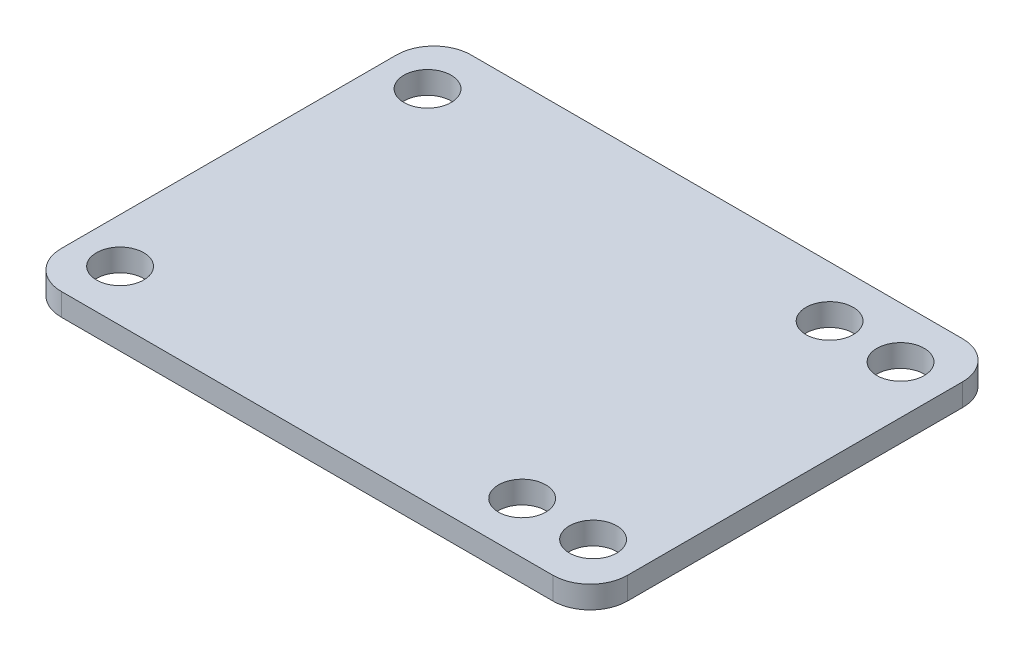
ISO-10303-21;
HEADER;
FILE_DESCRIPTION(('STEP AP214'),'2;1');
FILE_NAME('part.step','',(''),(''),'','','');
FILE_SCHEMA(('AUTOMOTIVE_DESIGN { 1 0 10303 214 1 1 1 1 }'));
ENDSEC;
DATA;
#1=APPLICATION_CONTEXT('core data for automotive mechanical design processes');
#2=APPLICATION_PROTOCOL_DEFINITION('international standard','automotive_design',2000,#1);
#3=PRODUCT_CONTEXT('',#1,'mechanical');
#4=PRODUCT('Part','Part','',(#3));
#5=PRODUCT_RELATED_PRODUCT_CATEGORY('part','',(#4));
#6=PRODUCT_DEFINITION_FORMATION('','',#4);
#7=PRODUCT_DEFINITION_CONTEXT('part definition',#1,'design');
#8=PRODUCT_DEFINITION('design','',#6,#7);
#9=PRODUCT_DEFINITION_SHAPE('','',#8);
#10=(LENGTH_UNIT() NAMED_UNIT(*) SI_UNIT(.MILLI.,.METRE.));
#11=(NAMED_UNIT(*) PLANE_ANGLE_UNIT() SI_UNIT($,.RADIAN.));
#12=(NAMED_UNIT(*) SI_UNIT($,.STERADIAN.) SOLID_ANGLE_UNIT());
#13=UNCERTAINTY_MEASURE_WITH_UNIT(LENGTH_MEASURE(1.E-05),#10,'distance_accuracy_value','');
#14=(GEOMETRIC_REPRESENTATION_CONTEXT(3) GLOBAL_UNCERTAINTY_ASSIGNED_CONTEXT((#13)) GLOBAL_UNIT_ASSIGNED_CONTEXT((#10,
#11,#12)) REPRESENTATION_CONTEXT('',''));
#15=CARTESIAN_POINT('',(0.,0.,0.));
#16=DIRECTION('',(0.,0.,1.));
#17=DIRECTION('',(1.,0.,0.));
#18=AXIS2_PLACEMENT_3D('',#15,#16,#17);
#19=CARTESIAN_POINT('',(0.,3.,0.));
#20=DIRECTION('',(1.,0.,0.));
#21=DIRECTION('',(0.,0.,-1.));
#22=AXIS2_PLACEMENT_3D('',#19,#20,#21);
#23=PLANE('',#22);
#24=DIRECTION('',(0.,0.,1.));
#25=VECTOR('',#24,1.);
#26=CARTESIAN_POINT('',(0.,0.,0.));
#27=LINE('',#26,#25);
#28=CARTESIAN_POINT('',(0.,0.,-50.));
#29=VERTEX_POINT('',#28);
#30=CARTESIAN_POINT('',(0.,0.,-5.));
#31=VERTEX_POINT('',#30);
#32=EDGE_CURVE('E138',#29,#31,#27,.T.);
#33=ORIENTED_EDGE('',*,*,#32,.T.);
#34=DIRECTION('',(0.,-1.,0.));
#35=VECTOR('',#34,1.);
#36=CARTESIAN_POINT('',(0.,3.,-5.));
#37=LINE('',#36,#35);
#38=CARTESIAN_POINT('',(0.,3.,-5.));
#39=VERTEX_POINT('',#38);
#40=EDGE_CURVE('E161',#31,#39,#37,.F.);
#41=ORIENTED_EDGE('',*,*,#40,.T.);
#42=DIRECTION('',(0.,0.,1.));
#43=VECTOR('',#42,1.);
#44=CARTESIAN_POINT('',(0.,3.,0.));
#45=LINE('',#44,#43);
#46=CARTESIAN_POINT('',(0.,3.,-50.));
#47=VERTEX_POINT('',#46);
#48=EDGE_CURVE('E136',#47,#39,#45,.T.);
#49=ORIENTED_EDGE('',*,*,#48,.F.);
#50=DIRECTION('',(0.,-1.,0.));
#51=VECTOR('',#50,1.);
#52=CARTESIAN_POINT('',(0.,3.,-50.));
#53=LINE('',#52,#51);
#54=EDGE_CURVE('E158',#47,#29,#53,.T.);
#55=ORIENTED_EDGE('',*,*,#54,.T.);
#56=EDGE_LOOP('',(#33,#41,#49,#55));
#57=FACE_BOUND('',#56,.T.);
#58=ADVANCED_FACE('F43',(#57),#23,.F.);
#59=CARTESIAN_POINT('',(0.,3.,0.));
#60=DIRECTION('',(0.,0.,-1.));
#61=DIRECTION('',(-1.,0.,0.));
#62=AXIS2_PLACEMENT_3D('',#59,#60,#61);
#63=PLANE('',#62);
#64=DIRECTION('',(1.,0.,0.));
#65=VECTOR('',#64,1.);
#66=CARTESIAN_POINT('',(0.,0.,0.));
#67=LINE('',#66,#65);
#68=CARTESIAN_POINT('',(5.,0.,0.));
#69=VERTEX_POINT('',#68);
#70=CARTESIAN_POINT('',(71.,0.,0.));
#71=VERTEX_POINT('',#70);
#72=EDGE_CURVE('E134',#69,#71,#67,.T.);
#73=ORIENTED_EDGE('',*,*,#72,.T.);
#74=DIRECTION('',(0.,-1.,0.));
#75=VECTOR('',#74,1.);
#76=CARTESIAN_POINT('',(71.,3.,0.));
#77=LINE('',#76,#75);
#78=CARTESIAN_POINT('',(71.,3.,0.));
#79=VERTEX_POINT('',#78);
#80=EDGE_CURVE('E113',#71,#79,#77,.F.);
#81=ORIENTED_EDGE('',*,*,#80,.T.);
#82=DIRECTION('',(1.,0.,0.));
#83=VECTOR('',#82,1.);
#84=CARTESIAN_POINT('',(0.,3.,0.));
#85=LINE('',#84,#83);
#86=CARTESIAN_POINT('',(5.,3.,0.));
#87=VERTEX_POINT('',#86);
#88=EDGE_CURVE('E177',#87,#79,#85,.T.);
#89=ORIENTED_EDGE('',*,*,#88,.F.);
#90=DIRECTION('',(0.,-1.,0.));
#91=VECTOR('',#90,1.);
#92=CARTESIAN_POINT('',(5.,3.,0.));
#93=LINE('',#92,#91);
#94=EDGE_CURVE('E118',#87,#69,#93,.T.);
#95=ORIENTED_EDGE('',*,*,#94,.T.);
#96=EDGE_LOOP('',(#73,#81,#89,#95));
#97=FACE_BOUND('',#96,.T.);
#98=ADVANCED_FACE('F234',(#97),#63,.F.);
#99=CARTESIAN_POINT('',(76.,3.,0.));
#100=DIRECTION('',(-1.,0.,0.));
#101=DIRECTION('',(0.,0.,1.));
#102=AXIS2_PLACEMENT_3D('',#99,#100,#101);
#103=PLANE('',#102);
#104=DIRECTION('',(0.,0.,-1.));
#105=VECTOR('',#104,1.);
#106=CARTESIAN_POINT('',(76.,3.,0.));
#107=LINE('',#106,#105);
#108=CARTESIAN_POINT('',(76.,3.,-5.));
#109=VERTEX_POINT('',#108);
#110=CARTESIAN_POINT('',(76.,3.,-50.));
#111=VERTEX_POINT('',#110);
#112=EDGE_CURVE('E127',#109,#111,#107,.T.);
#113=ORIENTED_EDGE('',*,*,#112,.F.);
#114=DIRECTION('',(0.,-1.,0.));
#115=VECTOR('',#114,1.);
#116=CARTESIAN_POINT('',(76.,3.,-5.));
#117=LINE('',#116,#115);
#118=CARTESIAN_POINT('',(76.,0.,-5.));
#119=VERTEX_POINT('',#118);
#120=EDGE_CURVE('E112',#109,#119,#117,.T.);
#121=ORIENTED_EDGE('',*,*,#120,.T.);
#122=DIRECTION('',(0.,0.,-1.));
#123=VECTOR('',#122,1.);
#124=CARTESIAN_POINT('',(76.,0.,0.));
#125=LINE('',#124,#123);
#126=CARTESIAN_POINT('',(76.,0.,-50.));
#127=VERTEX_POINT('',#126);
#128=EDGE_CURVE('E125',#119,#127,#125,.T.);
#129=ORIENTED_EDGE('',*,*,#128,.T.);
#130=DIRECTION('',(0.,-1.,0.));
#131=VECTOR('',#130,1.);
#132=CARTESIAN_POINT('',(76.,3.,-50.));
#133=LINE('',#132,#131);
#134=EDGE_CURVE('E129',#127,#111,#133,.F.);
#135=ORIENTED_EDGE('',*,*,#134,.T.);
#136=EDGE_LOOP('',(#113,#121,#129,#135));
#137=FACE_BOUND('',#136,.T.);
#138=ADVANCED_FACE('F124',(#137),#103,.F.);
#139=CARTESIAN_POINT('',(0.,3.,-55.));
#140=DIRECTION('',(0.,0.,1.));
#141=DIRECTION('',(1.,0.,0.));
#142=AXIS2_PLACEMENT_3D('',#139,#140,#141);
#143=PLANE('',#142);
#144=DIRECTION('',(-1.,0.,0.));
#145=VECTOR('',#144,1.);
#146=CARTESIAN_POINT('',(0.,0.,-55.));
#147=LINE('',#146,#145);
#148=CARTESIAN_POINT('',(71.,0.,-55.));
#149=VERTEX_POINT('',#148);
#150=CARTESIAN_POINT('',(4.99999999999999,0.,-55.));
#151=VERTEX_POINT('',#150);
#152=EDGE_CURVE('E133',#149,#151,#147,.T.);
#153=ORIENTED_EDGE('',*,*,#152,.T.);
#154=DIRECTION('',(0.,-1.,0.));
#155=VECTOR('',#154,1.);
#156=CARTESIAN_POINT('',(4.99999999999999,3.,-55.));
#157=LINE('',#156,#155);
#158=CARTESIAN_POINT('',(4.99999999999999,3.,-55.));
#159=VERTEX_POINT('',#158);
#160=EDGE_CURVE('E11',#151,#159,#157,.F.);
#161=ORIENTED_EDGE('',*,*,#160,.T.);
#162=DIRECTION('',(-1.,0.,0.));
#163=VECTOR('',#162,1.);
#164=CARTESIAN_POINT('',(0.,3.,-55.));
#165=LINE('',#164,#163);
#166=CARTESIAN_POINT('',(71.,3.,-55.));
#167=VERTEX_POINT('',#166);
#168=EDGE_CURVE('E142',#167,#159,#165,.T.);
#169=ORIENTED_EDGE('',*,*,#168,.F.);
#170=DIRECTION('',(0.,-1.,0.));
#171=VECTOR('',#170,1.);
#172=CARTESIAN_POINT('',(71.,3.,-55.));
#173=LINE('',#172,#171);
#174=EDGE_CURVE('E51',#167,#149,#173,.T.);
#175=ORIENTED_EDGE('',*,*,#174,.T.);
#176=EDGE_LOOP('',(#153,#161,#169,#175));
#177=FACE_BOUND('',#176,.T.);
#178=ADVANCED_FACE('F164',(#177),#143,.F.);
#179=CARTESIAN_POINT('',(0.,3.,0.));
#180=DIRECTION('',(0.,-1.,0.));
#181=DIRECTION('',(0.,0.,-1.));
#182=AXIS2_PLACEMENT_3D('',#179,#180,#181);
#183=PLANE('',#182);
#184=CARTESIAN_POINT('',(6.025,3.,-6.8625));
#185=DIRECTION('',(0.,1.,0.));
#186=DIRECTION('',(0.,0.,1.));
#187=AXIS2_PLACEMENT_3D('',#184,#185,#186);
#188=CIRCLE('',#187,3.175);
#189=CARTESIAN_POINT('',(6.025,3.,-3.6875));
#190=VERTEX_POINT('',#189);
#191=EDGE_CURVE('E196',#190,#190,#188,.T.);
#192=ORIENTED_EDGE('',*,*,#191,.F.);
#193=EDGE_LOOP('',(#192));
#194=FACE_BOUND('',#193,.T.);
#195=CARTESIAN_POINT('',(60.,3.,-6.8625));
#196=DIRECTION('',(0.,1.,0.));
#197=DIRECTION('',(0.,0.,1.));
#198=AXIS2_PLACEMENT_3D('',#195,#196,#197);
#199=CIRCLE('',#198,3.175);
#200=CARTESIAN_POINT('',(60.,3.,-3.6875));
#201=VERTEX_POINT('',#200);
#202=EDGE_CURVE('E202',#201,#201,#199,.T.);
#203=ORIENTED_EDGE('',*,*,#202,.F.);
#204=EDGE_LOOP('',(#203));
#205=FACE_BOUND('',#204,.T.);
#206=CARTESIAN_POINT('',(69.525,3.,-6.8625));
#207=DIRECTION('',(0.,1.,0.));
#208=DIRECTION('',(0.,0.,1.));
#209=AXIS2_PLACEMENT_3D('',#206,#207,#208);
#210=CIRCLE('',#209,3.175);
#211=CARTESIAN_POINT('',(69.525,3.,-3.6875));
#212=VERTEX_POINT('',#211);
#213=EDGE_CURVE('E208',#212,#212,#210,.T.);
#214=ORIENTED_EDGE('',*,*,#213,.F.);
#215=EDGE_LOOP('',(#214));
#216=FACE_BOUND('',#215,.T.);
#217=CARTESIAN_POINT('',(69.525,3.,-48.1375));
#218=DIRECTION('',(0.,1.,0.));
#219=DIRECTION('',(0.,0.,1.));
#220=AXIS2_PLACEMENT_3D('',#217,#218,#219);
#221=CIRCLE('',#220,3.175);
#222=CARTESIAN_POINT('',(69.525,3.,-44.9625));
#223=VERTEX_POINT('',#222);
#224=EDGE_CURVE('E214',#223,#223,#221,.T.);
#225=ORIENTED_EDGE('',*,*,#224,.F.);
#226=EDGE_LOOP('',(#225));
#227=FACE_BOUND('',#226,.T.);
#228=CARTESIAN_POINT('',(60.,3.,-48.1375));
#229=DIRECTION('',(0.,1.,0.));
#230=DIRECTION('',(0.,0.,1.));
#231=AXIS2_PLACEMENT_3D('',#228,#229,#230);
#232=CIRCLE('',#231,3.175);
#233=CARTESIAN_POINT('',(60.,3.,-44.9625));
#234=VERTEX_POINT('',#233);
#235=EDGE_CURVE('E191',#234,#234,#232,.T.);
#236=ORIENTED_EDGE('',*,*,#235,.F.);
#237=EDGE_LOOP('',(#236));
#238=FACE_BOUND('',#237,.T.);
#239=CARTESIAN_POINT('',(6.025,3.,-48.1375));
#240=DIRECTION('',(0.,1.,0.));
#241=DIRECTION('',(0.,0.,1.));
#242=AXIS2_PLACEMENT_3D('',#239,#240,#241);
#243=CIRCLE('',#242,3.175);
#244=CARTESIAN_POINT('',(6.025,3.,-44.9625));
#245=VERTEX_POINT('',#244);
#246=EDGE_CURVE('E182',#245,#245,#243,.T.);
#247=ORIENTED_EDGE('',*,*,#246,.F.);
#248=EDGE_LOOP('',(#247));
#249=FACE_BOUND('',#248,.T.);
#250=ORIENTED_EDGE('',*,*,#88,.T.);
#251=CARTESIAN_POINT('',(71.,3.,-5.));
#252=DIRECTION('',(0.,-1.,0.));
#253=DIRECTION('',(0.,0.,-1.));
#254=AXIS2_PLACEMENT_3D('',#251,#252,#253);
#255=CIRCLE('',#254,5.);
#256=EDGE_CURVE('E156',#79,#109,#255,.F.);
#257=ORIENTED_EDGE('',*,*,#256,.T.);
#258=ORIENTED_EDGE('',*,*,#112,.T.);
#259=CARTESIAN_POINT('',(71.,3.,-50.));
#260=DIRECTION('',(0.,-1.,0.));
#261=DIRECTION('',(0.,0.,-1.));
#262=AXIS2_PLACEMENT_3D('',#259,#260,#261);
#263=CIRCLE('',#262,5.);
#264=EDGE_CURVE('E63',#111,#167,#263,.F.);
#265=ORIENTED_EDGE('',*,*,#264,.T.);
#266=ORIENTED_EDGE('',*,*,#168,.T.);
#267=CARTESIAN_POINT('',(4.99999999999999,3.,-50.));
#268=DIRECTION('',(0.,-1.,0.));
#269=DIRECTION('',(0.,0.,-1.));
#270=AXIS2_PLACEMENT_3D('',#267,#268,#269);
#271=CIRCLE('',#270,5.);
#272=EDGE_CURVE('E152',#159,#47,#271,.F.);
#273=ORIENTED_EDGE('',*,*,#272,.T.);
#274=ORIENTED_EDGE('',*,*,#48,.T.);
#275=CARTESIAN_POINT('',(5.,3.,-5.));
#276=DIRECTION('',(0.,-1.,0.));
#277=DIRECTION('',(0.,0.,-1.));
#278=AXIS2_PLACEMENT_3D('',#275,#276,#277);
#279=CIRCLE('',#278,5.);
#280=EDGE_CURVE('E154',#39,#87,#279,.F.);
#281=ORIENTED_EDGE('',*,*,#280,.T.);
#282=EDGE_LOOP('',(#250,#257,#258,#265,#266,#273,#274,#281));
#283=FACE_BOUND('',#282,.T.);
#284=ADVANCED_FACE('F225',(#194,#205,#216,#227,#238,#249,#283),#183,.F.);
#285=CARTESIAN_POINT('',(0.,0.,0.));
#286=DIRECTION('',(0.,-1.,0.));
#287=DIRECTION('',(0.,0.,-1.));
#288=AXIS2_PLACEMENT_3D('',#285,#286,#287);
#289=PLANE('',#288);
#290=CARTESIAN_POINT('',(6.025,0.,-6.8625));
#291=DIRECTION('',(0.,1.,0.));
#292=DIRECTION('',(0.,0.,1.));
#293=AXIS2_PLACEMENT_3D('',#290,#291,#292);
#294=CIRCLE('',#293,3.175);
#295=CARTESIAN_POINT('',(6.025,0.,-3.6875));
#296=VERTEX_POINT('',#295);
#297=EDGE_CURVE('E193',#296,#296,#294,.T.);
#298=ORIENTED_EDGE('',*,*,#297,.T.);
#299=EDGE_LOOP('',(#298));
#300=FACE_BOUND('',#299,.T.);
#301=CARTESIAN_POINT('',(60.,0.,-6.8625));
#302=DIRECTION('',(0.,1.,0.));
#303=DIRECTION('',(0.,0.,1.));
#304=AXIS2_PLACEMENT_3D('',#301,#302,#303);
#305=CIRCLE('',#304,3.175);
#306=CARTESIAN_POINT('',(60.,0.,-3.6875));
#307=VERTEX_POINT('',#306);
#308=EDGE_CURVE('E199',#307,#307,#305,.T.);
#309=ORIENTED_EDGE('',*,*,#308,.T.);
#310=EDGE_LOOP('',(#309));
#311=FACE_BOUND('',#310,.T.);
#312=CARTESIAN_POINT('',(69.525,0.,-6.8625));
#313=DIRECTION('',(0.,1.,0.));
#314=DIRECTION('',(0.,0.,1.));
#315=AXIS2_PLACEMENT_3D('',#312,#313,#314);
#316=CIRCLE('',#315,3.175);
#317=CARTESIAN_POINT('',(69.525,0.,-3.6875));
#318=VERTEX_POINT('',#317);
#319=EDGE_CURVE('E205',#318,#318,#316,.T.);
#320=ORIENTED_EDGE('',*,*,#319,.T.);
#321=EDGE_LOOP('',(#320));
#322=FACE_BOUND('',#321,.T.);
#323=CARTESIAN_POINT('',(69.525,0.,-48.1375));
#324=DIRECTION('',(0.,1.,0.));
#325=DIRECTION('',(0.,0.,1.));
#326=AXIS2_PLACEMENT_3D('',#323,#324,#325);
#327=CIRCLE('',#326,3.175);
#328=CARTESIAN_POINT('',(69.525,0.,-44.9625));
#329=VERTEX_POINT('',#328);
#330=EDGE_CURVE('E211',#329,#329,#327,.T.);
#331=ORIENTED_EDGE('',*,*,#330,.T.);
#332=EDGE_LOOP('',(#331));
#333=FACE_BOUND('',#332,.T.);
#334=CARTESIAN_POINT('',(60.,0.,-48.1375));
#335=DIRECTION('',(0.,1.,0.));
#336=DIRECTION('',(0.,0.,1.));
#337=AXIS2_PLACEMENT_3D('',#334,#335,#336);
#338=CIRCLE('',#337,3.175);
#339=CARTESIAN_POINT('',(60.,0.,-44.9625));
#340=VERTEX_POINT('',#339);
#341=EDGE_CURVE('E217',#340,#340,#338,.T.);
#342=ORIENTED_EDGE('',*,*,#341,.T.);
#343=EDGE_LOOP('',(#342));
#344=FACE_BOUND('',#343,.T.);
#345=CARTESIAN_POINT('',(6.025,0.,-48.1375));
#346=DIRECTION('',(0.,1.,0.));
#347=DIRECTION('',(0.,0.,1.));
#348=AXIS2_PLACEMENT_3D('',#345,#346,#347);
#349=CIRCLE('',#348,3.175);
#350=CARTESIAN_POINT('',(6.025,0.,-44.9625));
#351=VERTEX_POINT('',#350);
#352=EDGE_CURVE('E186',#351,#351,#349,.T.);
#353=ORIENTED_EDGE('',*,*,#352,.T.);
#354=EDGE_LOOP('',(#353));
#355=FACE_BOUND('',#354,.T.);
#356=ORIENTED_EDGE('',*,*,#128,.F.);
#357=CARTESIAN_POINT('',(71.,0.,-5.));
#358=DIRECTION('',(0.,-1.,0.));
#359=DIRECTION('',(0.,0.,-1.));
#360=AXIS2_PLACEMENT_3D('',#357,#358,#359);
#361=CIRCLE('',#360,5.);
#362=EDGE_CURVE('E108',#119,#71,#361,.T.);
#363=ORIENTED_EDGE('',*,*,#362,.T.);
#364=ORIENTED_EDGE('',*,*,#72,.F.);
#365=CARTESIAN_POINT('',(5.,0.,-5.));
#366=DIRECTION('',(0.,-1.,0.));
#367=DIRECTION('',(0.,0.,-1.));
#368=AXIS2_PLACEMENT_3D('',#365,#366,#367);
#369=CIRCLE('',#368,5.);
#370=EDGE_CURVE('E119',#69,#31,#369,.T.);
#371=ORIENTED_EDGE('',*,*,#370,.T.);
#372=ORIENTED_EDGE('',*,*,#32,.F.);
#373=CARTESIAN_POINT('',(4.99999999999999,0.,-50.));
#374=DIRECTION('',(0.,-1.,0.));
#375=DIRECTION('',(0.,0.,-1.));
#376=AXIS2_PLACEMENT_3D('',#373,#374,#375);
#377=CIRCLE('',#376,5.);
#378=EDGE_CURVE('E145',#29,#151,#377,.T.);
#379=ORIENTED_EDGE('',*,*,#378,.T.);
#380=ORIENTED_EDGE('',*,*,#152,.F.);
#381=CARTESIAN_POINT('',(71.,0.,-50.));
#382=DIRECTION('',(0.,-1.,0.));
#383=DIRECTION('',(0.,0.,-1.));
#384=AXIS2_PLACEMENT_3D('',#381,#382,#383);
#385=CIRCLE('',#384,5.);
#386=EDGE_CURVE('E128',#149,#127,#385,.T.);
#387=ORIENTED_EDGE('',*,*,#386,.T.);
#388=EDGE_LOOP('',(#356,#363,#364,#371,#372,#379,#380,#387));
#389=FACE_BOUND('',#388,.T.);
#390=ADVANCED_FACE('F131',(#300,#311,#322,#333,#344,#355,#389),#289,.T.);
#391=CARTESIAN_POINT('',(71.,3.,-5.));
#392=DIRECTION('',(0.,-1.,0.));
#393=DIRECTION('',(0.,0.,-1.));
#394=AXIS2_PLACEMENT_3D('',#391,#392,#393);
#395=CYLINDRICAL_SURFACE('',#394,5.);
#396=ORIENTED_EDGE('',*,*,#256,.F.);
#397=ORIENTED_EDGE('',*,*,#80,.F.);
#398=ORIENTED_EDGE('',*,*,#362,.F.);
#399=ORIENTED_EDGE('',*,*,#120,.F.);
#400=EDGE_LOOP('',(#396,#397,#398,#399));
#401=FACE_BOUND('',#400,.T.);
#402=ADVANCED_FACE('F111',(#401),#395,.T.);
#403=CARTESIAN_POINT('',(5.,3.,-5.));
#404=DIRECTION('',(0.,-1.,0.));
#405=DIRECTION('',(0.,0.,-1.));
#406=AXIS2_PLACEMENT_3D('',#403,#404,#405);
#407=CYLINDRICAL_SURFACE('',#406,5.);
#408=ORIENTED_EDGE('',*,*,#280,.F.);
#409=ORIENTED_EDGE('',*,*,#40,.F.);
#410=ORIENTED_EDGE('',*,*,#370,.F.);
#411=ORIENTED_EDGE('',*,*,#94,.F.);
#412=EDGE_LOOP('',(#408,#409,#410,#411));
#413=FACE_BOUND('',#412,.T.);
#414=ADVANCED_FACE('F236',(#413),#407,.T.);
#415=CARTESIAN_POINT('',(4.99999999999999,3.,-50.));
#416=DIRECTION('',(0.,-1.,0.));
#417=DIRECTION('',(0.,0.,-1.));
#418=AXIS2_PLACEMENT_3D('',#415,#416,#417);
#419=CYLINDRICAL_SURFACE('',#418,5.);
#420=ORIENTED_EDGE('',*,*,#272,.F.);
#421=ORIENTED_EDGE('',*,*,#160,.F.);
#422=ORIENTED_EDGE('',*,*,#378,.F.);
#423=ORIENTED_EDGE('',*,*,#54,.F.);
#424=EDGE_LOOP('',(#420,#421,#422,#423));
#425=FACE_BOUND('',#424,.T.);
#426=ADVANCED_FACE('F171',(#425),#419,.T.);
#427=CARTESIAN_POINT('',(71.,3.,-50.));
#428=DIRECTION('',(0.,-1.,0.));
#429=DIRECTION('',(0.,0.,-1.));
#430=AXIS2_PLACEMENT_3D('',#427,#428,#429);
#431=CYLINDRICAL_SURFACE('',#430,5.);
#432=ORIENTED_EDGE('',*,*,#264,.F.);
#433=ORIENTED_EDGE('',*,*,#134,.F.);
#434=ORIENTED_EDGE('',*,*,#386,.F.);
#435=ORIENTED_EDGE('',*,*,#174,.F.);
#436=EDGE_LOOP('',(#432,#433,#434,#435));
#437=FACE_BOUND('',#436,.T.);
#438=ADVANCED_FACE('F45',(#437),#431,.T.);
#439=CARTESIAN_POINT('',(6.025,0.,-48.1375));
#440=DIRECTION('',(0.,1.,0.));
#441=DIRECTION('',(0.,0.,1.));
#442=AXIS2_PLACEMENT_3D('',#439,#440,#441);
#443=CYLINDRICAL_SURFACE('',#442,3.175);
#444=CARTESIAN_POINT('',(6.025,0.,-44.9625));
#445=CARTESIAN_POINT('',(6.025,0.0312499999999994,-44.9625));
#446=CARTESIAN_POINT('',(6.025,0.0624999999999994,-44.9625));
#447=CARTESIAN_POINT('',(6.025,0.125,-44.9625));
#448=CARTESIAN_POINT('',(6.025,0.15625,-44.9625));
#449=CARTESIAN_POINT('',(6.025,0.21875,-44.9625));
#450=CARTESIAN_POINT('',(6.025,0.25,-44.9625));
#451=CARTESIAN_POINT('',(6.025,0.3125,-44.9625));
#452=CARTESIAN_POINT('',(6.025,0.34375,-44.9625));
#453=CARTESIAN_POINT('',(6.025,0.40625,-44.9625));
#454=CARTESIAN_POINT('',(6.025,0.4375,-44.9625));
#455=CARTESIAN_POINT('',(6.025,0.5,-44.9625));
#456=CARTESIAN_POINT('',(6.025,0.53125,-44.9625));
#457=CARTESIAN_POINT('',(6.025,0.59375,-44.9625));
#458=CARTESIAN_POINT('',(6.025,0.625,-44.9625));
#459=CARTESIAN_POINT('',(6.025,0.6875,-44.9625));
#460=CARTESIAN_POINT('',(6.025,0.71875,-44.9625));
#461=CARTESIAN_POINT('',(6.025,0.78125,-44.9625));
#462=CARTESIAN_POINT('',(6.025,0.8125,-44.9625));
#463=CARTESIAN_POINT('',(6.025,0.875,-44.9625));
#464=CARTESIAN_POINT('',(6.025,0.90625,-44.9625));
#465=CARTESIAN_POINT('',(6.025,0.96875,-44.9625));
#466=CARTESIAN_POINT('',(6.025,1.,-44.9625));
#467=CARTESIAN_POINT('',(6.025,1.0625,-44.9625));
#468=CARTESIAN_POINT('',(6.025,1.09375,-44.9625));
#469=CARTESIAN_POINT('',(6.025,1.15625,-44.9625));
#470=CARTESIAN_POINT('',(6.025,1.1875,-44.9625));
#471=CARTESIAN_POINT('',(6.025,1.25,-44.9625));
#472=CARTESIAN_POINT('',(6.025,1.28125,-44.9625));
#473=CARTESIAN_POINT('',(6.025,1.34375,-44.9625));
#474=CARTESIAN_POINT('',(6.025,1.375,-44.9625));
#475=CARTESIAN_POINT('',(6.025,1.4375,-44.9625));
#476=CARTESIAN_POINT('',(6.025,1.46875,-44.9625));
#477=CARTESIAN_POINT('',(6.025,1.53125,-44.9625));
#478=CARTESIAN_POINT('',(6.025,1.5625,-44.9625));
#479=CARTESIAN_POINT('',(6.025,1.625,-44.9625));
#480=CARTESIAN_POINT('',(6.025,1.65625,-44.9625));
#481=CARTESIAN_POINT('',(6.025,1.71875,-44.9625));
#482=CARTESIAN_POINT('',(6.025,1.75,-44.9625));
#483=CARTESIAN_POINT('',(6.025,1.8125,-44.9625));
#484=CARTESIAN_POINT('',(6.025,1.84375,-44.9625));
#485=CARTESIAN_POINT('',(6.025,1.90625,-44.9625));
#486=CARTESIAN_POINT('',(6.025,1.9375,-44.9625));
#487=CARTESIAN_POINT('',(6.025,2.,-44.9625));
#488=CARTESIAN_POINT('',(6.025,2.03125,-44.9625));
#489=CARTESIAN_POINT('',(6.025,2.09375,-44.9625));
#490=CARTESIAN_POINT('',(6.025,2.125,-44.9625));
#491=CARTESIAN_POINT('',(6.025,2.1875,-44.9625));
#492=CARTESIAN_POINT('',(6.025,2.21875,-44.9625));
#493=CARTESIAN_POINT('',(6.025,2.28125,-44.9625));
#494=CARTESIAN_POINT('',(6.025,2.3125,-44.9625));
#495=CARTESIAN_POINT('',(6.025,2.375,-44.9625));
#496=CARTESIAN_POINT('',(6.025,2.40625,-44.9625));
#497=CARTESIAN_POINT('',(6.025,2.46875,-44.9625));
#498=CARTESIAN_POINT('',(6.025,2.5,-44.9625));
#499=CARTESIAN_POINT('',(6.025,2.5625,-44.9625));
#500=CARTESIAN_POINT('',(6.025,2.59375,-44.9625));
#501=CARTESIAN_POINT('',(6.025,2.65625,-44.9625));
#502=CARTESIAN_POINT('',(6.025,2.6875,-44.9625));
#503=CARTESIAN_POINT('',(6.025,2.75,-44.9625));
#504=CARTESIAN_POINT('',(6.025,2.78125,-44.9625));
#505=CARTESIAN_POINT('',(6.025,2.84375,-44.9625));
#506=CARTESIAN_POINT('',(6.025,2.875,-44.9625));
#507=CARTESIAN_POINT('',(6.025,2.9375,-44.9625));
#508=CARTESIAN_POINT('',(6.025,2.96875,-44.9625));
#509=CARTESIAN_POINT('',(6.025,3.,-44.9625));
#510=B_SPLINE_CURVE_WITH_KNOTS('',3,(#444,#445,#446,#447,#448,#449,#450,#451,#452,#453,#454,
#455,#456,#457,#458,#459,#460,#461,#462,#463,#464,#465,#466,#467,#468,#469,#470,#471,#472,#473,
#474,#475,#476,#477,#478,#479,#480,#481,#482,#483,#484,#485,#486,#487,#488,#489,#490,#491,#492,
#493,#494,#495,#496,#497,#498,#499,#500,#501,#502,#503,#504,#505,#506,#507,#508,#509),
.UNSPECIFIED.,.F.,.F.,(4,2,2,2,2,2,2,2,2,2,2,2,2,2,2,2,2,2,2,2,2,2,2,2,2,2,2,2,2,2,2,2,4),(0.,
0.0937500000000001,0.1875,0.28125,0.375,0.46875,0.5625,0.656250000000001,0.750000000000001,
0.843750000000001,0.937500000000001,1.03125,1.125,1.21875,1.3125,1.40625,1.5,1.59375,1.6875,
1.78125,1.875,1.96875,2.0625,2.15625,2.25,2.34375,2.4375,2.53125,2.625,2.71875,2.8125,2.90625,
3.),.UNSPECIFIED.);
#511=EDGE_CURVE('BSEAM258',#351,#245,#510,.T.);
#512=ORIENTED_EDGE('',*,*,#352,.F.);
#513=ORIENTED_EDGE('',*,*,#246,.T.);
#514=ORIENTED_EDGE('',*,*,#511,.T.);
#515=ORIENTED_EDGE('',*,*,#511,.F.);
#516=EDGE_LOOP('',(#512,#514,#513,#515));
#517=FACE_BOUND('',#516,.T.);
#518=ADVANCED_FACE('F258',(#517),#443,.F.);
#519=CARTESIAN_POINT('',(60.,0.,-48.1375));
#520=DIRECTION('',(0.,1.,0.));
#521=DIRECTION('',(0.,0.,1.));
#522=AXIS2_PLACEMENT_3D('',#519,#520,#521);
#523=CYLINDRICAL_SURFACE('',#522,3.175);
#524=CARTESIAN_POINT('',(60.,0.,-44.9625));
#525=CARTESIAN_POINT('',(60.,0.0312499999999994,-44.9625));
#526=CARTESIAN_POINT('',(60.,0.0624999999999994,-44.9625));
#527=CARTESIAN_POINT('',(60.,0.125,-44.9625));
#528=CARTESIAN_POINT('',(60.,0.15625,-44.9625));
#529=CARTESIAN_POINT('',(60.,0.21875,-44.9625));
#530=CARTESIAN_POINT('',(60.,0.25,-44.9625));
#531=CARTESIAN_POINT('',(60.,0.3125,-44.9625));
#532=CARTESIAN_POINT('',(60.,0.34375,-44.9625));
#533=CARTESIAN_POINT('',(60.,0.40625,-44.9625));
#534=CARTESIAN_POINT('',(60.,0.4375,-44.9625));
#535=CARTESIAN_POINT('',(60.,0.5,-44.9625));
#536=CARTESIAN_POINT('',(60.,0.53125,-44.9625));
#537=CARTESIAN_POINT('',(60.,0.59375,-44.9625));
#538=CARTESIAN_POINT('',(60.,0.625,-44.9625));
#539=CARTESIAN_POINT('',(60.,0.6875,-44.9625));
#540=CARTESIAN_POINT('',(60.,0.71875,-44.9625));
#541=CARTESIAN_POINT('',(60.,0.78125,-44.9625));
#542=CARTESIAN_POINT('',(60.,0.8125,-44.9625));
#543=CARTESIAN_POINT('',(60.,0.875,-44.9625));
#544=CARTESIAN_POINT('',(60.,0.90625,-44.9625));
#545=CARTESIAN_POINT('',(60.,0.96875,-44.9625));
#546=CARTESIAN_POINT('',(60.,1.,-44.9625));
#547=CARTESIAN_POINT('',(60.,1.0625,-44.9625));
#548=CARTESIAN_POINT('',(60.,1.09375,-44.9625));
#549=CARTESIAN_POINT('',(60.,1.15625,-44.9625));
#550=CARTESIAN_POINT('',(60.,1.1875,-44.9625));
#551=CARTESIAN_POINT('',(60.,1.25,-44.9625));
#552=CARTESIAN_POINT('',(60.,1.28125,-44.9625));
#553=CARTESIAN_POINT('',(60.,1.34375,-44.9625));
#554=CARTESIAN_POINT('',(60.,1.375,-44.9625));
#555=CARTESIAN_POINT('',(60.,1.4375,-44.9625));
#556=CARTESIAN_POINT('',(60.,1.46875,-44.9625));
#557=CARTESIAN_POINT('',(60.,1.53125,-44.9625));
#558=CARTESIAN_POINT('',(60.,1.5625,-44.9625));
#559=CARTESIAN_POINT('',(60.,1.625,-44.9625));
#560=CARTESIAN_POINT('',(60.,1.65625,-44.9625));
#561=CARTESIAN_POINT('',(60.,1.71875,-44.9625));
#562=CARTESIAN_POINT('',(60.,1.75,-44.9625));
#563=CARTESIAN_POINT('',(60.,1.8125,-44.9625));
#564=CARTESIAN_POINT('',(60.,1.84375,-44.9625));
#565=CARTESIAN_POINT('',(60.,1.90625,-44.9625));
#566=CARTESIAN_POINT('',(60.,1.9375,-44.9625));
#567=CARTESIAN_POINT('',(60.,2.,-44.9625));
#568=CARTESIAN_POINT('',(60.,2.03125,-44.9625));
#569=CARTESIAN_POINT('',(60.,2.09375,-44.9625));
#570=CARTESIAN_POINT('',(60.,2.125,-44.9625));
#571=CARTESIAN_POINT('',(60.,2.1875,-44.9625));
#572=CARTESIAN_POINT('',(60.,2.21875,-44.9625));
#573=CARTESIAN_POINT('',(60.,2.28125,-44.9625));
#574=CARTESIAN_POINT('',(60.,2.3125,-44.9625));
#575=CARTESIAN_POINT('',(60.,2.375,-44.9625));
#576=CARTESIAN_POINT('',(60.,2.40625,-44.9625));
#577=CARTESIAN_POINT('',(60.,2.46875,-44.9625));
#578=CARTESIAN_POINT('',(60.,2.5,-44.9625));
#579=CARTESIAN_POINT('',(60.,2.5625,-44.9625));
#580=CARTESIAN_POINT('',(60.,2.59375,-44.9625));
#581=CARTESIAN_POINT('',(60.,2.65625,-44.9625));
#582=CARTESIAN_POINT('',(60.,2.6875,-44.9625));
#583=CARTESIAN_POINT('',(60.,2.75,-44.9625));
#584=CARTESIAN_POINT('',(60.,2.78125,-44.9625));
#585=CARTESIAN_POINT('',(60.,2.84375,-44.9625));
#586=CARTESIAN_POINT('',(60.,2.875,-44.9625));
#587=CARTESIAN_POINT('',(60.,2.9375,-44.9625));
#588=CARTESIAN_POINT('',(60.,2.96875,-44.9625));
#589=CARTESIAN_POINT('',(60.,3.,-44.9625));
#590=B_SPLINE_CURVE_WITH_KNOTS('',3,(#524,#525,#526,#527,#528,#529,#530,#531,#532,#533,#534,
#535,#536,#537,#538,#539,#540,#541,#542,#543,#544,#545,#546,#547,#548,#549,#550,#551,#552,#553,
#554,#555,#556,#557,#558,#559,#560,#561,#562,#563,#564,#565,#566,#567,#568,#569,#570,#571,#572,
#573,#574,#575,#576,#577,#578,#579,#580,#581,#582,#583,#584,#585,#586,#587,#588,#589),
.UNSPECIFIED.,.F.,.F.,(4,2,2,2,2,2,2,2,2,2,2,2,2,2,2,2,2,2,2,2,2,2,2,2,2,2,2,2,2,2,2,2,4),(0.,
0.0937500000000001,0.1875,0.28125,0.375,0.46875,0.5625,0.656250000000001,0.750000000000001,
0.843750000000001,0.937500000000001,1.03125,1.125,1.21875,1.3125,1.40625,1.5,1.59375,1.6875,
1.78125,1.875,1.96875,2.0625,2.15625,2.25,2.34375,2.4375,2.53125,2.625,2.71875,2.8125,2.90625,
3.),.UNSPECIFIED.);
#591=EDGE_CURVE('BSEAM223',#340,#234,#590,.T.);
#592=ORIENTED_EDGE('',*,*,#341,.F.);
#593=ORIENTED_EDGE('',*,*,#235,.T.);
#594=ORIENTED_EDGE('',*,*,#591,.T.);
#595=ORIENTED_EDGE('',*,*,#591,.F.);
#596=EDGE_LOOP('',(#592,#594,#593,#595));
#597=FACE_BOUND('',#596,.T.);
#598=ADVANCED_FACE('F223',(#597),#523,.F.);
#599=CARTESIAN_POINT('',(69.525,0.,-48.1375));
#600=DIRECTION('',(0.,1.,0.));
#601=DIRECTION('',(0.,0.,1.));
#602=AXIS2_PLACEMENT_3D('',#599,#600,#601);
#603=CYLINDRICAL_SURFACE('',#602,3.175);
#604=CARTESIAN_POINT('',(69.525,0.,-44.9625));
#605=CARTESIAN_POINT('',(69.525,0.0312499999999994,-44.9625));
#606=CARTESIAN_POINT('',(69.525,0.0624999999999994,-44.9625));
#607=CARTESIAN_POINT('',(69.525,0.125,-44.9625));
#608=CARTESIAN_POINT('',(69.525,0.15625,-44.9625));
#609=CARTESIAN_POINT('',(69.525,0.21875,-44.9625));
#610=CARTESIAN_POINT('',(69.525,0.25,-44.9625));
#611=CARTESIAN_POINT('',(69.525,0.3125,-44.9625));
#612=CARTESIAN_POINT('',(69.525,0.34375,-44.9625));
#613=CARTESIAN_POINT('',(69.525,0.40625,-44.9625));
#614=CARTESIAN_POINT('',(69.525,0.4375,-44.9625));
#615=CARTESIAN_POINT('',(69.525,0.5,-44.9625));
#616=CARTESIAN_POINT('',(69.525,0.53125,-44.9625));
#617=CARTESIAN_POINT('',(69.525,0.59375,-44.9625));
#618=CARTESIAN_POINT('',(69.525,0.625,-44.9625));
#619=CARTESIAN_POINT('',(69.525,0.6875,-44.9625));
#620=CARTESIAN_POINT('',(69.525,0.71875,-44.9625));
#621=CARTESIAN_POINT('',(69.525,0.78125,-44.9625));
#622=CARTESIAN_POINT('',(69.525,0.8125,-44.9625));
#623=CARTESIAN_POINT('',(69.525,0.875,-44.9625));
#624=CARTESIAN_POINT('',(69.525,0.90625,-44.9625));
#625=CARTESIAN_POINT('',(69.525,0.96875,-44.9625));
#626=CARTESIAN_POINT('',(69.525,1.,-44.9625));
#627=CARTESIAN_POINT('',(69.525,1.0625,-44.9625));
#628=CARTESIAN_POINT('',(69.525,1.09375,-44.9625));
#629=CARTESIAN_POINT('',(69.525,1.15625,-44.9625));
#630=CARTESIAN_POINT('',(69.525,1.1875,-44.9625));
#631=CARTESIAN_POINT('',(69.525,1.25,-44.9625));
#632=CARTESIAN_POINT('',(69.525,1.28125,-44.9625));
#633=CARTESIAN_POINT('',(69.525,1.34375,-44.9625));
#634=CARTESIAN_POINT('',(69.525,1.375,-44.9625));
#635=CARTESIAN_POINT('',(69.525,1.4375,-44.9625));
#636=CARTESIAN_POINT('',(69.525,1.46875,-44.9625));
#637=CARTESIAN_POINT('',(69.525,1.53125,-44.9625));
#638=CARTESIAN_POINT('',(69.525,1.5625,-44.9625));
#639=CARTESIAN_POINT('',(69.525,1.625,-44.9625));
#640=CARTESIAN_POINT('',(69.525,1.65625,-44.9625));
#641=CARTESIAN_POINT('',(69.525,1.71875,-44.9625));
#642=CARTESIAN_POINT('',(69.525,1.75,-44.9625));
#643=CARTESIAN_POINT('',(69.525,1.8125,-44.9625));
#644=CARTESIAN_POINT('',(69.525,1.84375,-44.9625));
#645=CARTESIAN_POINT('',(69.525,1.90625,-44.9625));
#646=CARTESIAN_POINT('',(69.525,1.9375,-44.9625));
#647=CARTESIAN_POINT('',(69.525,2.,-44.9625));
#648=CARTESIAN_POINT('',(69.525,2.03125,-44.9625));
#649=CARTESIAN_POINT('',(69.525,2.09375,-44.9625));
#650=CARTESIAN_POINT('',(69.525,2.125,-44.9625));
#651=CARTESIAN_POINT('',(69.525,2.1875,-44.9625));
#652=CARTESIAN_POINT('',(69.525,2.21875,-44.9625));
#653=CARTESIAN_POINT('',(69.525,2.28125,-44.9625));
#654=CARTESIAN_POINT('',(69.525,2.3125,-44.9625));
#655=CARTESIAN_POINT('',(69.525,2.375,-44.9625));
#656=CARTESIAN_POINT('',(69.525,2.40625,-44.9625));
#657=CARTESIAN_POINT('',(69.525,2.46875,-44.9625));
#658=CARTESIAN_POINT('',(69.525,2.5,-44.9625));
#659=CARTESIAN_POINT('',(69.525,2.5625,-44.9625));
#660=CARTESIAN_POINT('',(69.525,2.59375,-44.9625));
#661=CARTESIAN_POINT('',(69.525,2.65625,-44.9625));
#662=CARTESIAN_POINT('',(69.525,2.6875,-44.9625));
#663=CARTESIAN_POINT('',(69.525,2.75,-44.9625));
#664=CARTESIAN_POINT('',(69.525,2.78125,-44.9625));
#665=CARTESIAN_POINT('',(69.525,2.84375,-44.9625));
#666=CARTESIAN_POINT('',(69.525,2.875,-44.9625));
#667=CARTESIAN_POINT('',(69.525,2.9375,-44.9625));
#668=CARTESIAN_POINT('',(69.525,2.96875,-44.9625));
#669=CARTESIAN_POINT('',(69.525,3.,-44.9625));
#670=B_SPLINE_CURVE_WITH_KNOTS('',3,(#604,#605,#606,#607,#608,#609,#610,#611,#612,#613,#614,
#615,#616,#617,#618,#619,#620,#621,#622,#623,#624,#625,#626,#627,#628,#629,#630,#631,#632,#633,
#634,#635,#636,#637,#638,#639,#640,#641,#642,#643,#644,#645,#646,#647,#648,#649,#650,#651,#652,
#653,#654,#655,#656,#657,#658,#659,#660,#661,#662,#663,#664,#665,#666,#667,#668,#669),
.UNSPECIFIED.,.F.,.F.,(4,2,2,2,2,2,2,2,2,2,2,2,2,2,2,2,2,2,2,2,2,2,2,2,2,2,2,2,2,2,2,2,4),(0.,
0.0937500000000001,0.1875,0.28125,0.375,0.46875,0.5625,0.656250000000001,0.750000000000001,
0.843750000000001,0.937500000000001,1.03125,1.125,1.21875,1.3125,1.40625,1.5,1.59375,1.6875,
1.78125,1.875,1.96875,2.0625,2.15625,2.25,2.34375,2.4375,2.53125,2.625,2.71875,2.8125,2.90625,
3.),.UNSPECIFIED.);
#671=EDGE_CURVE('BSEAM273',#329,#223,#670,.T.);
#672=ORIENTED_EDGE('',*,*,#330,.F.);
#673=ORIENTED_EDGE('',*,*,#224,.T.);
#674=ORIENTED_EDGE('',*,*,#671,.T.);
#675=ORIENTED_EDGE('',*,*,#671,.F.);
#676=EDGE_LOOP('',(#672,#674,#673,#675));
#677=FACE_BOUND('',#676,.T.);
#678=ADVANCED_FACE('F273',(#677),#603,.F.);
#679=CARTESIAN_POINT('',(69.525,0.,-6.8625));
#680=DIRECTION('',(0.,1.,0.));
#681=DIRECTION('',(0.,0.,1.));
#682=AXIS2_PLACEMENT_3D('',#679,#680,#681);
#683=CYLINDRICAL_SURFACE('',#682,3.175);
#684=CARTESIAN_POINT('',(69.525,0.,-3.6875));
#685=CARTESIAN_POINT('',(69.525,0.0312499999999968,-3.6875));
#686=CARTESIAN_POINT('',(69.525,0.0624999999999968,-3.6875));
#687=CARTESIAN_POINT('',(69.525,0.124999999999997,-3.6875));
#688=CARTESIAN_POINT('',(69.525,0.156249999999997,-3.6875));
#689=CARTESIAN_POINT('',(69.525,0.218749999999997,-3.6875));
#690=CARTESIAN_POINT('',(69.525,0.249999999999997,-3.6875));
#691=CARTESIAN_POINT('',(69.525,0.312499999999997,-3.6875));
#692=CARTESIAN_POINT('',(69.525,0.343749999999997,-3.6875));
#693=CARTESIAN_POINT('',(69.525,0.406249999999997,-3.6875));
#694=CARTESIAN_POINT('',(69.525,0.437499999999997,-3.6875));
#695=CARTESIAN_POINT('',(69.525,0.499999999999997,-3.6875));
#696=CARTESIAN_POINT('',(69.525,0.531249999999997,-3.6875));
#697=CARTESIAN_POINT('',(69.525,0.593749999999997,-3.6875));
#698=CARTESIAN_POINT('',(69.525,0.624999999999997,-3.6875));
#699=CARTESIAN_POINT('',(69.525,0.687499999999997,-3.6875));
#700=CARTESIAN_POINT('',(69.525,0.718749999999997,-3.6875));
#701=CARTESIAN_POINT('',(69.525,0.781249999999998,-3.6875));
#702=CARTESIAN_POINT('',(69.525,0.812499999999998,-3.6875));
#703=CARTESIAN_POINT('',(69.525,0.874999999999998,-3.6875));
#704=CARTESIAN_POINT('',(69.525,0.906249999999998,-3.6875));
#705=CARTESIAN_POINT('',(69.525,0.968749999999998,-3.6875));
#706=CARTESIAN_POINT('',(69.525,0.999999999999998,-3.6875));
#707=CARTESIAN_POINT('',(69.525,1.0625,-3.6875));
#708=CARTESIAN_POINT('',(69.525,1.09375,-3.6875));
#709=CARTESIAN_POINT('',(69.525,1.15625,-3.6875));
#710=CARTESIAN_POINT('',(69.525,1.1875,-3.6875));
#711=CARTESIAN_POINT('',(69.525,1.25,-3.6875));
#712=CARTESIAN_POINT('',(69.525,1.28125,-3.6875));
#713=CARTESIAN_POINT('',(69.525,1.34375,-3.6875));
#714=CARTESIAN_POINT('',(69.525,1.375,-3.6875));
#715=CARTESIAN_POINT('',(69.525,1.4375,-3.6875));
#716=CARTESIAN_POINT('',(69.525,1.46875,-3.6875));
#717=CARTESIAN_POINT('',(69.525,1.53125,-3.6875));
#718=CARTESIAN_POINT('',(69.525,1.5625,-3.6875));
#719=CARTESIAN_POINT('',(69.525,1.625,-3.6875));
#720=CARTESIAN_POINT('',(69.525,1.65625,-3.6875));
#721=CARTESIAN_POINT('',(69.525,1.71875,-3.6875));
#722=CARTESIAN_POINT('',(69.525,1.75,-3.6875));
#723=CARTESIAN_POINT('',(69.525,1.8125,-3.6875));
#724=CARTESIAN_POINT('',(69.525,1.84375,-3.6875));
#725=CARTESIAN_POINT('',(69.525,1.90625,-3.6875));
#726=CARTESIAN_POINT('',(69.525,1.9375,-3.6875));
#727=CARTESIAN_POINT('',(69.525,2.,-3.6875));
#728=CARTESIAN_POINT('',(69.525,2.03125,-3.6875));
#729=CARTESIAN_POINT('',(69.525,2.09375,-3.6875));
#730=CARTESIAN_POINT('',(69.525,2.125,-3.6875));
#731=CARTESIAN_POINT('',(69.525,2.1875,-3.6875));
#732=CARTESIAN_POINT('',(69.525,2.21875,-3.6875));
#733=CARTESIAN_POINT('',(69.525,2.28125,-3.6875));
#734=CARTESIAN_POINT('',(69.525,2.3125,-3.6875));
#735=CARTESIAN_POINT('',(69.525,2.375,-3.6875));
#736=CARTESIAN_POINT('',(69.525,2.40625,-3.6875));
#737=CARTESIAN_POINT('',(69.525,2.46875,-3.6875));
#738=CARTESIAN_POINT('',(69.525,2.5,-3.6875));
#739=CARTESIAN_POINT('',(69.525,2.5625,-3.6875));
#740=CARTESIAN_POINT('',(69.525,2.59375,-3.6875));
#741=CARTESIAN_POINT('',(69.525,2.65625,-3.6875));
#742=CARTESIAN_POINT('',(69.525,2.6875,-3.6875));
#743=CARTESIAN_POINT('',(69.525,2.75,-3.6875));
#744=CARTESIAN_POINT('',(69.525,2.78125,-3.6875));
#745=CARTESIAN_POINT('',(69.525,2.84375,-3.6875));
#746=CARTESIAN_POINT('',(69.525,2.875,-3.6875));
#747=CARTESIAN_POINT('',(69.525,2.9375,-3.6875));
#748=CARTESIAN_POINT('',(69.525,2.96875,-3.6875));
#749=CARTESIAN_POINT('',(69.525,3.,-3.6875));
#750=B_SPLINE_CURVE_WITH_KNOTS('',3,(#684,#685,#686,#687,#688,#689,#690,#691,#692,#693,#694,
#695,#696,#697,#698,#699,#700,#701,#702,#703,#704,#705,#706,#707,#708,#709,#710,#711,#712,#713,
#714,#715,#716,#717,#718,#719,#720,#721,#722,#723,#724,#725,#726,#727,#728,#729,#730,#731,#732,
#733,#734,#735,#736,#737,#738,#739,#740,#741,#742,#743,#744,#745,#746,#747,#748,#749),
.UNSPECIFIED.,.F.,.F.,(4,2,2,2,2,2,2,2,2,2,2,2,2,2,2,2,2,2,2,2,2,2,2,2,2,2,2,2,2,2,2,2,4),(0.,
0.0937500000000001,0.1875,0.28125,0.375,0.46875,0.5625,0.656250000000001,0.750000000000001,
0.843750000000001,0.937500000000001,1.03125,1.125,1.21875,1.3125,1.40625,1.5,1.59375,1.6875,
1.78125,1.875,1.96875,2.0625,2.15625,2.25,2.34375,2.4375,2.53125,2.625,2.71875,2.8125,2.90625,
3.),.UNSPECIFIED.);
#751=EDGE_CURVE('BSEAM269',#318,#212,#750,.T.);
#752=ORIENTED_EDGE('',*,*,#319,.F.);
#753=ORIENTED_EDGE('',*,*,#213,.T.);
#754=ORIENTED_EDGE('',*,*,#751,.T.);
#755=ORIENTED_EDGE('',*,*,#751,.F.);
#756=EDGE_LOOP('',(#752,#754,#753,#755));
#757=FACE_BOUND('',#756,.T.);
#758=ADVANCED_FACE('F269',(#757),#683,.F.);
#759=CARTESIAN_POINT('',(60.,0.,-6.8625));
#760=DIRECTION('',(0.,1.,0.));
#761=DIRECTION('',(0.,0.,1.));
#762=AXIS2_PLACEMENT_3D('',#759,#760,#761);
#763=CYLINDRICAL_SURFACE('',#762,3.175);
#764=CARTESIAN_POINT('',(60.,0.,-3.6875));
#765=CARTESIAN_POINT('',(60.,0.0312499999999968,-3.6875));
#766=CARTESIAN_POINT('',(60.,0.0624999999999968,-3.6875));
#767=CARTESIAN_POINT('',(60.,0.124999999999997,-3.6875));
#768=CARTESIAN_POINT('',(60.,0.156249999999997,-3.6875));
#769=CARTESIAN_POINT('',(60.,0.218749999999997,-3.6875));
#770=CARTESIAN_POINT('',(60.,0.249999999999997,-3.6875));
#771=CARTESIAN_POINT('',(60.,0.312499999999997,-3.6875));
#772=CARTESIAN_POINT('',(60.,0.343749999999997,-3.6875));
#773=CARTESIAN_POINT('',(60.,0.406249999999997,-3.6875));
#774=CARTESIAN_POINT('',(60.,0.437499999999997,-3.6875));
#775=CARTESIAN_POINT('',(60.,0.499999999999997,-3.6875));
#776=CARTESIAN_POINT('',(60.,0.531249999999997,-3.6875));
#777=CARTESIAN_POINT('',(60.,0.593749999999997,-3.6875));
#778=CARTESIAN_POINT('',(60.,0.624999999999997,-3.6875));
#779=CARTESIAN_POINT('',(60.,0.687499999999997,-3.6875));
#780=CARTESIAN_POINT('',(60.,0.718749999999997,-3.6875));
#781=CARTESIAN_POINT('',(60.,0.781249999999998,-3.6875));
#782=CARTESIAN_POINT('',(60.,0.812499999999998,-3.6875));
#783=CARTESIAN_POINT('',(60.,0.874999999999998,-3.6875));
#784=CARTESIAN_POINT('',(60.,0.906249999999998,-3.6875));
#785=CARTESIAN_POINT('',(60.,0.968749999999998,-3.6875));
#786=CARTESIAN_POINT('',(60.,0.999999999999998,-3.6875));
#787=CARTESIAN_POINT('',(60.,1.0625,-3.6875));
#788=CARTESIAN_POINT('',(60.,1.09375,-3.6875));
#789=CARTESIAN_POINT('',(60.,1.15625,-3.6875));
#790=CARTESIAN_POINT('',(60.,1.1875,-3.6875));
#791=CARTESIAN_POINT('',(60.,1.25,-3.6875));
#792=CARTESIAN_POINT('',(60.,1.28125,-3.6875));
#793=CARTESIAN_POINT('',(60.,1.34375,-3.6875));
#794=CARTESIAN_POINT('',(60.,1.375,-3.6875));
#795=CARTESIAN_POINT('',(60.,1.4375,-3.6875));
#796=CARTESIAN_POINT('',(60.,1.46875,-3.6875));
#797=CARTESIAN_POINT('',(60.,1.53125,-3.6875));
#798=CARTESIAN_POINT('',(60.,1.5625,-3.6875));
#799=CARTESIAN_POINT('',(60.,1.625,-3.6875));
#800=CARTESIAN_POINT('',(60.,1.65625,-3.6875));
#801=CARTESIAN_POINT('',(60.,1.71875,-3.6875));
#802=CARTESIAN_POINT('',(60.,1.75,-3.6875));
#803=CARTESIAN_POINT('',(60.,1.8125,-3.6875));
#804=CARTESIAN_POINT('',(60.,1.84375,-3.6875));
#805=CARTESIAN_POINT('',(60.,1.90625,-3.6875));
#806=CARTESIAN_POINT('',(60.,1.9375,-3.6875));
#807=CARTESIAN_POINT('',(60.,2.,-3.6875));
#808=CARTESIAN_POINT('',(60.,2.03125,-3.6875));
#809=CARTESIAN_POINT('',(60.,2.09375,-3.6875));
#810=CARTESIAN_POINT('',(60.,2.125,-3.6875));
#811=CARTESIAN_POINT('',(60.,2.1875,-3.6875));
#812=CARTESIAN_POINT('',(60.,2.21875,-3.6875));
#813=CARTESIAN_POINT('',(60.,2.28125,-3.6875));
#814=CARTESIAN_POINT('',(60.,2.3125,-3.6875));
#815=CARTESIAN_POINT('',(60.,2.375,-3.6875));
#816=CARTESIAN_POINT('',(60.,2.40625,-3.6875));
#817=CARTESIAN_POINT('',(60.,2.46875,-3.6875));
#818=CARTESIAN_POINT('',(60.,2.5,-3.6875));
#819=CARTESIAN_POINT('',(60.,2.5625,-3.6875));
#820=CARTESIAN_POINT('',(60.,2.59375,-3.6875));
#821=CARTESIAN_POINT('',(60.,2.65625,-3.6875));
#822=CARTESIAN_POINT('',(60.,2.6875,-3.6875));
#823=CARTESIAN_POINT('',(60.,2.75,-3.6875));
#824=CARTESIAN_POINT('',(60.,2.78125,-3.6875));
#825=CARTESIAN_POINT('',(60.,2.84375,-3.6875));
#826=CARTESIAN_POINT('',(60.,2.875,-3.6875));
#827=CARTESIAN_POINT('',(60.,2.9375,-3.6875));
#828=CARTESIAN_POINT('',(60.,2.96875,-3.6875));
#829=CARTESIAN_POINT('',(60.,3.,-3.6875));
#830=B_SPLINE_CURVE_WITH_KNOTS('',3,(#764,#765,#766,#767,#768,#769,#770,#771,#772,#773,#774,
#775,#776,#777,#778,#779,#780,#781,#782,#783,#784,#785,#786,#787,#788,#789,#790,#791,#792,#793,
#794,#795,#796,#797,#798,#799,#800,#801,#802,#803,#804,#805,#806,#807,#808,#809,#810,#811,#812,
#813,#814,#815,#816,#817,#818,#819,#820,#821,#822,#823,#824,#825,#826,#827,#828,#829),
.UNSPECIFIED.,.F.,.F.,(4,2,2,2,2,2,2,2,2,2,2,2,2,2,2,2,2,2,2,2,2,2,2,2,2,2,2,2,2,2,2,2,4),(0.,
0.0937500000000001,0.1875,0.28125,0.375,0.46875,0.5625,0.656250000000001,0.750000000000001,
0.843750000000001,0.937500000000001,1.03125,1.125,1.21875,1.3125,1.40625,1.5,1.59375,1.6875,
1.78125,1.875,1.96875,2.0625,2.15625,2.25,2.34375,2.4375,2.53125,2.625,2.71875,2.8125,2.90625,
3.),.UNSPECIFIED.);
#831=EDGE_CURVE('BSEAM265',#307,#201,#830,.T.);
#832=ORIENTED_EDGE('',*,*,#308,.F.);
#833=ORIENTED_EDGE('',*,*,#202,.T.);
#834=ORIENTED_EDGE('',*,*,#831,.T.);
#835=ORIENTED_EDGE('',*,*,#831,.F.);
#836=EDGE_LOOP('',(#832,#834,#833,#835));
#837=FACE_BOUND('',#836,.T.);
#838=ADVANCED_FACE('F265',(#837),#763,.F.);
#839=CARTESIAN_POINT('',(6.025,0.,-6.8625));
#840=DIRECTION('',(0.,1.,0.));
#841=DIRECTION('',(0.,0.,1.));
#842=AXIS2_PLACEMENT_3D('',#839,#840,#841);
#843=CYLINDRICAL_SURFACE('',#842,3.175);
#844=CARTESIAN_POINT('',(6.025,0.,-3.6875));
#845=CARTESIAN_POINT('',(6.025,0.0312499999999968,-3.6875));
#846=CARTESIAN_POINT('',(6.025,0.0624999999999968,-3.6875));
#847=CARTESIAN_POINT('',(6.025,0.124999999999997,-3.6875));
#848=CARTESIAN_POINT('',(6.025,0.156249999999997,-3.6875));
#849=CARTESIAN_POINT('',(6.025,0.218749999999997,-3.6875));
#850=CARTESIAN_POINT('',(6.025,0.249999999999997,-3.6875));
#851=CARTESIAN_POINT('',(6.025,0.312499999999997,-3.6875));
#852=CARTESIAN_POINT('',(6.025,0.343749999999997,-3.6875));
#853=CARTESIAN_POINT('',(6.025,0.406249999999997,-3.6875));
#854=CARTESIAN_POINT('',(6.025,0.437499999999997,-3.6875));
#855=CARTESIAN_POINT('',(6.025,0.499999999999997,-3.6875));
#856=CARTESIAN_POINT('',(6.025,0.531249999999997,-3.6875));
#857=CARTESIAN_POINT('',(6.025,0.593749999999997,-3.6875));
#858=CARTESIAN_POINT('',(6.025,0.624999999999997,-3.6875));
#859=CARTESIAN_POINT('',(6.025,0.687499999999997,-3.6875));
#860=CARTESIAN_POINT('',(6.025,0.718749999999997,-3.6875));
#861=CARTESIAN_POINT('',(6.025,0.781249999999998,-3.6875));
#862=CARTESIAN_POINT('',(6.025,0.812499999999998,-3.6875));
#863=CARTESIAN_POINT('',(6.025,0.874999999999998,-3.6875));
#864=CARTESIAN_POINT('',(6.025,0.906249999999998,-3.6875));
#865=CARTESIAN_POINT('',(6.025,0.968749999999998,-3.6875));
#866=CARTESIAN_POINT('',(6.025,0.999999999999998,-3.6875));
#867=CARTESIAN_POINT('',(6.025,1.0625,-3.6875));
#868=CARTESIAN_POINT('',(6.025,1.09375,-3.6875));
#869=CARTESIAN_POINT('',(6.025,1.15625,-3.6875));
#870=CARTESIAN_POINT('',(6.025,1.1875,-3.6875));
#871=CARTESIAN_POINT('',(6.025,1.25,-3.6875));
#872=CARTESIAN_POINT('',(6.025,1.28125,-3.6875));
#873=CARTESIAN_POINT('',(6.025,1.34375,-3.6875));
#874=CARTESIAN_POINT('',(6.025,1.375,-3.6875));
#875=CARTESIAN_POINT('',(6.025,1.4375,-3.6875));
#876=CARTESIAN_POINT('',(6.025,1.46875,-3.6875));
#877=CARTESIAN_POINT('',(6.025,1.53125,-3.6875));
#878=CARTESIAN_POINT('',(6.025,1.5625,-3.6875));
#879=CARTESIAN_POINT('',(6.025,1.625,-3.6875));
#880=CARTESIAN_POINT('',(6.025,1.65625,-3.6875));
#881=CARTESIAN_POINT('',(6.025,1.71875,-3.6875));
#882=CARTESIAN_POINT('',(6.025,1.75,-3.6875));
#883=CARTESIAN_POINT('',(6.025,1.8125,-3.6875));
#884=CARTESIAN_POINT('',(6.025,1.84375,-3.6875));
#885=CARTESIAN_POINT('',(6.025,1.90625,-3.6875));
#886=CARTESIAN_POINT('',(6.025,1.9375,-3.6875));
#887=CARTESIAN_POINT('',(6.025,2.,-3.6875));
#888=CARTESIAN_POINT('',(6.025,2.03125,-3.6875));
#889=CARTESIAN_POINT('',(6.025,2.09375,-3.6875));
#890=CARTESIAN_POINT('',(6.025,2.125,-3.6875));
#891=CARTESIAN_POINT('',(6.025,2.1875,-3.6875));
#892=CARTESIAN_POINT('',(6.025,2.21875,-3.6875));
#893=CARTESIAN_POINT('',(6.025,2.28125,-3.6875));
#894=CARTESIAN_POINT('',(6.025,2.3125,-3.6875));
#895=CARTESIAN_POINT('',(6.025,2.375,-3.6875));
#896=CARTESIAN_POINT('',(6.025,2.40625,-3.6875));
#897=CARTESIAN_POINT('',(6.025,2.46875,-3.6875));
#898=CARTESIAN_POINT('',(6.025,2.5,-3.6875));
#899=CARTESIAN_POINT('',(6.025,2.5625,-3.6875));
#900=CARTESIAN_POINT('',(6.025,2.59375,-3.6875));
#901=CARTESIAN_POINT('',(6.025,2.65625,-3.6875));
#902=CARTESIAN_POINT('',(6.025,2.6875,-3.6875));
#903=CARTESIAN_POINT('',(6.025,2.75,-3.6875));
#904=CARTESIAN_POINT('',(6.025,2.78125,-3.6875));
#905=CARTESIAN_POINT('',(6.025,2.84375,-3.6875));
#906=CARTESIAN_POINT('',(6.025,2.875,-3.6875));
#907=CARTESIAN_POINT('',(6.025,2.9375,-3.6875));
#908=CARTESIAN_POINT('',(6.025,2.96875,-3.6875));
#909=CARTESIAN_POINT('',(6.025,3.,-3.6875));
#910=B_SPLINE_CURVE_WITH_KNOTS('',3,(#844,#845,#846,#847,#848,#849,#850,#851,#852,#853,#854,
#855,#856,#857,#858,#859,#860,#861,#862,#863,#864,#865,#866,#867,#868,#869,#870,#871,#872,#873,
#874,#875,#876,#877,#878,#879,#880,#881,#882,#883,#884,#885,#886,#887,#888,#889,#890,#891,#892,
#893,#894,#895,#896,#897,#898,#899,#900,#901,#902,#903,#904,#905,#906,#907,#908,#909),
.UNSPECIFIED.,.F.,.F.,(4,2,2,2,2,2,2,2,2,2,2,2,2,2,2,2,2,2,2,2,2,2,2,2,2,2,2,2,2,2,2,2,4),(0.,
0.0937500000000001,0.1875,0.28125,0.375,0.46875,0.5625,0.656250000000001,0.750000000000001,
0.843750000000001,0.937500000000001,1.03125,1.125,1.21875,1.3125,1.40625,1.5,1.59375,1.6875,
1.78125,1.875,1.96875,2.0625,2.15625,2.25,2.34375,2.4375,2.53125,2.625,2.71875,2.8125,2.90625,
3.),.UNSPECIFIED.);
#911=EDGE_CURVE('BSEAM262',#296,#190,#910,.T.);
#912=ORIENTED_EDGE('',*,*,#297,.F.);
#913=ORIENTED_EDGE('',*,*,#191,.T.);
#914=ORIENTED_EDGE('',*,*,#911,.T.);
#915=ORIENTED_EDGE('',*,*,#911,.F.);
#916=EDGE_LOOP('',(#912,#914,#913,#915));
#917=FACE_BOUND('',#916,.T.);
#918=ADVANCED_FACE('F262',(#917),#843,.F.);
#919=CLOSED_SHELL('',(#58,#98,#138,#178,#284,#390,#402,#414,#426,#438,#518,#598,#678,#758,#838,#918));
#920=MANIFOLD_SOLID_BREP('B2',#919);
#921=ADVANCED_BREP_SHAPE_REPRESENTATION('',(#18,#920),#14);
#922=SHAPE_DEFINITION_REPRESENTATION(#9,#921);
ENDSEC;
END-ISO-10303-21;
